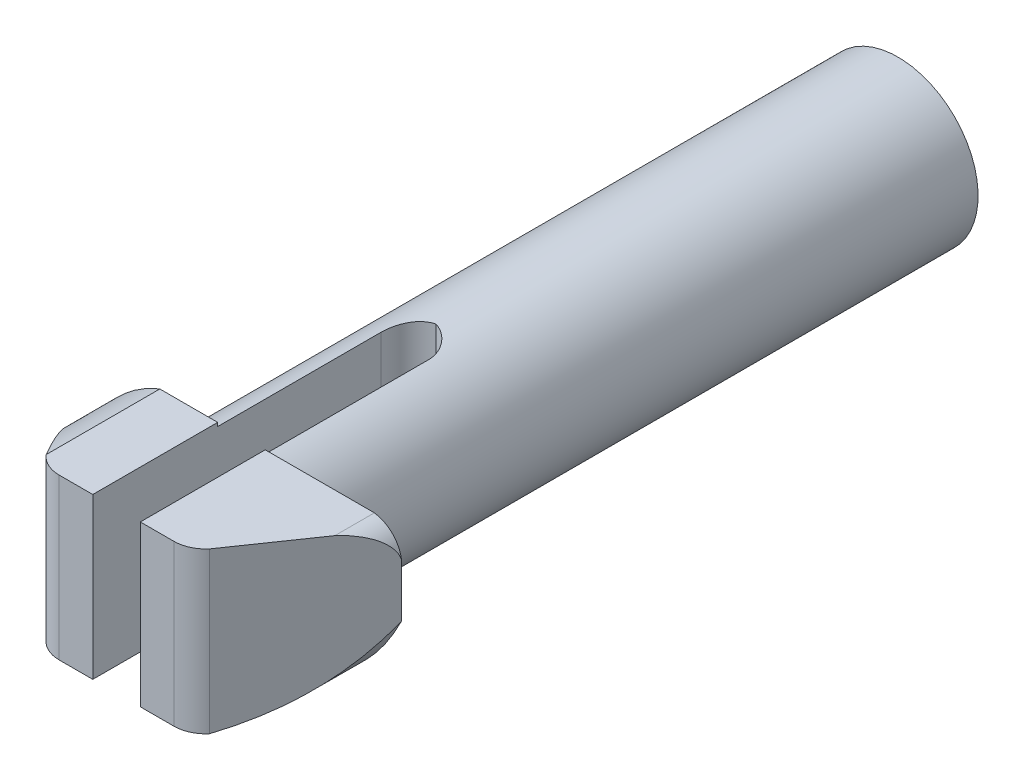
ISO-10303-21;
HEADER;
FILE_DESCRIPTION(('STEP AP214'),'2;1');
FILE_NAME('part.step','',(''),(''),'','','');
FILE_SCHEMA(('AUTOMOTIVE_DESIGN { 1 0 10303 214 1 1 1 1 }'));
ENDSEC;
DATA;
#1=APPLICATION_CONTEXT('core data for automotive mechanical design processes');
#2=APPLICATION_PROTOCOL_DEFINITION('international standard','automotive_design',2000,#1);
#3=PRODUCT_CONTEXT('',#1,'mechanical');
#4=PRODUCT('Part','Part','',(#3));
#5=PRODUCT_RELATED_PRODUCT_CATEGORY('part','',(#4));
#6=PRODUCT_DEFINITION_FORMATION('','',#4);
#7=PRODUCT_DEFINITION_CONTEXT('part definition',#1,'design');
#8=PRODUCT_DEFINITION('design','',#6,#7);
#9=PRODUCT_DEFINITION_SHAPE('','',#8);
#10=(LENGTH_UNIT() NAMED_UNIT(*) SI_UNIT(.MILLI.,.METRE.));
#11=(NAMED_UNIT(*) PLANE_ANGLE_UNIT() SI_UNIT($,.RADIAN.));
#12=(NAMED_UNIT(*) SI_UNIT($,.STERADIAN.) SOLID_ANGLE_UNIT());
#13=UNCERTAINTY_MEASURE_WITH_UNIT(LENGTH_MEASURE(1.E-05),#10,'distance_accuracy_value','');
#14=(GEOMETRIC_REPRESENTATION_CONTEXT(3) GLOBAL_UNCERTAINTY_ASSIGNED_CONTEXT((#13)) GLOBAL_UNIT_ASSIGNED_CONTEXT((#10,
#11,#12)) REPRESENTATION_CONTEXT('',''));
#15=CARTESIAN_POINT('',(0.,0.,0.));
#16=DIRECTION('',(0.,0.,1.));
#17=DIRECTION('',(1.,0.,0.));
#18=AXIS2_PLACEMENT_3D('',#15,#16,#17);
#19=CARTESIAN_POINT('',(0.583306021167324,6.35,0.));
#20=DIRECTION('',(0.,0.,-1.));
#21=DIRECTION('',(-1.,0.,0.));
#22=AXIS2_PLACEMENT_3D('',#19,#20,#21);
#23=PLANE('',#22);
#24=DIRECTION('',(1.,0.,0.));
#25=VECTOR('',#24,1.);
#26=CARTESIAN_POINT('',(0.583306021167324,0.,0.));
#27=LINE('',#26,#25);
#28=CARTESIAN_POINT('',(0.583306021167324,0.,0.));
#29=VERTEX_POINT('',#28);
#30=CARTESIAN_POINT('',(1.91439198881262,0.,0.));
#31=VERTEX_POINT('',#30);
#32=EDGE_CURVE('E184',#29,#31,#27,.T.);
#33=ORIENTED_EDGE('',*,*,#32,.T.);
#34=DIRECTION('',(0.,1.,0.));
#35=VECTOR('',#34,1.);
#36=CARTESIAN_POINT('',(1.91439198881262,-12.8393072586905,0.));
#37=LINE('',#36,#35);
#38=CARTESIAN_POINT('',(1.91439198881262,6.35,0.));
#39=VERTEX_POINT('',#38);
#40=EDGE_CURVE('E168',#31,#39,#37,.T.);
#41=ORIENTED_EDGE('',*,*,#40,.T.);
#42=DIRECTION('',(1.,0.,0.));
#43=VECTOR('',#42,1.);
#44=CARTESIAN_POINT('',(0.583306021167324,6.35,0.));
#45=LINE('',#44,#43);
#46=CARTESIAN_POINT('',(0.583306021167324,6.35,0.));
#47=VERTEX_POINT('',#46);
#48=EDGE_CURVE('E182',#47,#39,#45,.T.);
#49=ORIENTED_EDGE('',*,*,#48,.F.);
#50=DIRECTION('',(0.,-1.,0.));
#51=VECTOR('',#50,1.);
#52=CARTESIAN_POINT('',(0.583306021167324,6.35,0.));
#53=LINE('',#52,#51);
#54=EDGE_CURVE('E200',#47,#29,#53,.T.);
#55=ORIENTED_EDGE('',*,*,#54,.T.);
#56=EDGE_LOOP('',(#33,#41,#49,#55));
#57=FACE_BOUND('',#56,.T.);
#58=ADVANCED_FACE('F39',(#57),#23,.F.);
#59=CARTESIAN_POINT('',(5.13169397883267,6.35,-1.27));
#60=DIRECTION('',(0.,1.,0.));
#61=DIRECTION('',(0.,0.,1.));
#62=AXIS2_PLACEMENT_3D('',#59,#60,#61);
#63=PLANE('',#62);
#64=DIRECTION('',(0.,0.,1.));
#65=VECTOR('',#64,1.);
#66=CARTESIAN_POINT('',(1.91439198881262,6.35,0.));
#67=LINE('',#66,#65);
#68=CARTESIAN_POINT('',(1.91439198881262,6.35,-4.953));
#69=VERTEX_POINT('',#68);
#70=EDGE_CURVE('E164',#69,#39,#67,.T.);
#71=ORIENTED_EDGE('',*,*,#70,.F.);
#72=DIRECTION('',(-1.,0.,0.));
#73=VECTOR('',#72,1.);
#74=CARTESIAN_POINT('',(-0.3175,6.35,-4.953));
#75=LINE('',#74,#73);
#76=CARTESIAN_POINT('',(-0.380077487087856,6.35,-4.953));
#77=VERTEX_POINT('',#76);
#78=EDGE_CURVE('E548',#69,#77,#75,.T.);
#79=ORIENTED_EDGE('',*,*,#78,.T.);
#80=DIRECTION('',(0.,0.,1.));
#81=VECTOR('',#80,1.);
#82=CARTESIAN_POINT('',(-0.380077487087855,6.35,-9.39909929026359));
#83=LINE('',#82,#81);
#84=CARTESIAN_POINT('',(-0.380077487087855,6.35,-0.442478268550039));
#85=VERTEX_POINT('',#84);
#86=EDGE_CURVE('E310',#77,#85,#83,.T.);
#87=ORIENTED_EDGE('',*,*,#86,.T.);
#88=CARTESIAN_POINT('',(0.583306021167324,6.35,-1.27));
#89=DIRECTION('',(0.,1.,0.));
#90=DIRECTION('',(0.,0.,-1.));
#91=AXIS2_PLACEMENT_3D('',#88,#89,#90);
#92=CIRCLE('',#91,1.27);
#93=EDGE_CURVE('E191',#85,#47,#92,.T.);
#94=ORIENTED_EDGE('',*,*,#93,.T.);
#95=ORIENTED_EDGE('',*,*,#48,.T.);
#96=EDGE_LOOP('',(#71,#79,#87,#94,#95));
#97=FACE_BOUND('',#96,.T.);
#98=ADVANCED_FACE('F188',(#97),#63,.T.);
#99=CARTESIAN_POINT('',(5.13169397883267,0.,-1.27));
#100=DIRECTION('',(0.,1.,0.));
#101=DIRECTION('',(0.,0.,1.));
#102=AXIS2_PLACEMENT_3D('',#99,#100,#101);
#103=PLANE('',#102);
#104=DIRECTION('',(-1.,0.,0.));
#105=VECTOR('',#104,1.);
#106=CARTESIAN_POINT('',(-0.3175,0.,-4.953));
#107=LINE('',#106,#105);
#108=CARTESIAN_POINT('',(1.91439198881262,0.,-4.953));
#109=VERTEX_POINT('',#108);
#110=CARTESIAN_POINT('',(-2.413,0.,-4.953));
#111=VERTEX_POINT('',#110);
#112=EDGE_CURVE('E209',#109,#111,#107,.T.);
#113=ORIENTED_EDGE('',*,*,#112,.F.);
#114=DIRECTION('',(0.,0.,-1.));
#115=VECTOR('',#114,1.);
#116=CARTESIAN_POINT('',(1.91439198881262,0.,0.));
#117=LINE('',#116,#115);
#118=EDGE_CURVE('E551',#31,#109,#117,.T.);
#119=ORIENTED_EDGE('',*,*,#118,.F.);
#120=ORIENTED_EDGE('',*,*,#32,.F.);
#121=CARTESIAN_POINT('',(0.583306021167324,0.,-1.27));
#122=DIRECTION('',(0.,1.,0.));
#123=DIRECTION('',(0.,0.,-1.));
#124=AXIS2_PLACEMENT_3D('',#121,#122,#123);
#125=CIRCLE('',#124,1.27);
#126=CARTESIAN_POINT('',(-0.380077487087855,0.,-0.442478268550039));
#127=VERTEX_POINT('',#126);
#128=EDGE_CURVE('E218',#127,#29,#125,.T.);
#129=ORIENTED_EDGE('',*,*,#128,.F.);
#130=DIRECTION('',(0.567945370231995,0.,0.82306625275979));
#131=VECTOR('',#130,1.);
#132=CARTESIAN_POINT('',(-0.380077487087855,0.,-0.44247826855004));
#133=LINE('',#132,#131);
#134=CARTESIAN_POINT('',(-2.413,0.,-3.38858893790919));
#135=VERTEX_POINT('',#134);
#136=EDGE_CURVE('E215',#135,#127,#133,.T.);
#137=ORIENTED_EDGE('',*,*,#136,.F.);
#138=DIRECTION('',(0.,0.,1.));
#139=VECTOR('',#138,1.);
#140=CARTESIAN_POINT('',(-2.413,0.,-9.39909929026359));
#141=LINE('',#140,#139);
#142=EDGE_CURVE('E350',#111,#135,#141,.T.);
#143=ORIENTED_EDGE('',*,*,#142,.F.);
#144=EDGE_LOOP('',(#113,#119,#120,#129,#137,#143));
#145=FACE_BOUND('',#144,.T.);
#146=ADVANCED_FACE('F397',(#145),#103,.F.);
#147=CARTESIAN_POINT('',(-0.3175,6.35,-4.953));
#148=DIRECTION('',(0.,0.,1.));
#149=DIRECTION('',(1.,0.,0.));
#150=AXIS2_PLACEMENT_3D('',#147,#148,#149);
#151=PLANE('',#150);
#152=CARTESIAN_POINT('',(6.09507748708785,0.,-4.953));
#153=VERTEX_POINT('',#152);
#154=CARTESIAN_POINT('',(3.80060801118738,0.,-4.953));
#155=VERTEX_POINT('',#154);
#156=EDGE_CURVE('E211',#153,#155,#107,.T.);
#157=ORIENTED_EDGE('',*,*,#156,.T.);
#158=DIRECTION('',(0.,1.,0.));
#159=VECTOR('',#158,1.);
#160=CARTESIAN_POINT('',(3.80060801118737,6.35,-4.953));
#161=LINE('',#160,#159);
#162=CARTESIAN_POINT('',(3.80060801118737,0.143305378301734,-4.953));
#163=VERTEX_POINT('',#162);
#164=EDGE_CURVE('E531',#155,#163,#161,.T.);
#165=ORIENTED_EDGE('',*,*,#164,.T.);
#166=CARTESIAN_POINT('',(2.8575,3.175,-4.953));
#167=DIRECTION('',(0.,0.,-1.));
#168=DIRECTION('',(-1.,0.,0.));
#169=AXIS2_PLACEMENT_3D('',#166,#167,#168);
#170=CIRCLE('',#169,3.175);
#171=CARTESIAN_POINT('',(3.80060801118737,6.20669462169827,-4.953));
#172=VERTEX_POINT('',#171);
#173=EDGE_CURVE('E534',#172,#163,#170,.T.);
#174=ORIENTED_EDGE('',*,*,#173,.F.);
#175=CARTESIAN_POINT('',(3.80060801118738,6.35,-4.953));
#176=VERTEX_POINT('',#175);
#177=EDGE_CURVE('E526',#172,#176,#161,.T.);
#178=ORIENTED_EDGE('',*,*,#177,.T.);
#179=CARTESIAN_POINT('',(8.128,6.35,-4.953));
#180=VERTEX_POINT('',#179);
#181=EDGE_CURVE('E580',#180,#176,#75,.T.);
#182=ORIENTED_EDGE('',*,*,#181,.F.);
#183=CARTESIAN_POINT('',(7.95003143572846,5.09253143572846,-4.953));
#184=DIRECTION('',(0.,0.,1.));
#185=DIRECTION('',(1.,0.,0.));
#186=AXIS2_PLACEMENT_3D('',#183,#184,#185);
#187=CIRCLE('',#186,1.27);
#188=CARTESIAN_POINT('',(9.2075,5.2705,-4.953));
#189=VERTEX_POINT('',#188);
#190=EDGE_CURVE('E339',#189,#180,#187,.T.);
#191=ORIENTED_EDGE('',*,*,#190,.F.);
#192=DIRECTION('',(0.,-1.,0.));
#193=VECTOR('',#192,1.);
#194=CARTESIAN_POINT('',(9.2075,6.35,-4.953));
#195=LINE('',#194,#193);
#196=CARTESIAN_POINT('',(9.2075,3.175,-4.953));
#197=VERTEX_POINT('',#196);
#198=EDGE_CURVE('E235',#189,#197,#195,.T.);
#199=ORIENTED_EDGE('',*,*,#198,.T.);
#200=CARTESIAN_POINT('',(9.2075,3.175,-4.953));
#201=CARTESIAN_POINT('',(8.0010210107141,0.754914498683665,-4.953));
#202=CARTESIAN_POINT('',(6.09507748708785,0.,-4.953));
#203=B_SPLINE_CURVE_WITH_KNOTS('',2,(#200,#201,#202),.UNSPECIFIED.,.F.,.F.,(3,3),(0.,
0.5244633079158),.UNSPECIFIED.);
#204=EDGE_CURVE('E328',#153,#197,#203,.F.);
#205=ORIENTED_EDGE('',*,*,#204,.F.);
#206=EDGE_LOOP('',(#157,#165,#174,#178,#182,#191,#199,#205));
#207=FACE_BOUND('',#206,.T.);
#208=ADVANCED_FACE('F290',(#207),#151,.F.);
#209=CARTESIAN_POINT('',(5.13169397883267,6.35,-1.27));
#210=DIRECTION('',(0.,-1.,0.));
#211=DIRECTION('',(0.,0.,-1.));
#212=AXIS2_PLACEMENT_3D('',#209,#210,#211);
#213=CYLINDRICAL_SURFACE('',#212,1.27);
#214=CARTESIAN_POINT('',(5.13169397883267,0.,-1.27));
#215=DIRECTION('',(0.,1.,0.));
#216=DIRECTION('',(0.,0.,1.));
#217=AXIS2_PLACEMENT_3D('',#214,#215,#216);
#218=CIRCLE('',#217,1.27);
#219=CARTESIAN_POINT('',(5.13169397883267,0.,0.));
#220=VERTEX_POINT('',#219);
#221=CARTESIAN_POINT('',(6.09507748708785,0.,-0.44247826855004));
#222=VERTEX_POINT('',#221);
#223=EDGE_CURVE('E205',#220,#222,#218,.T.);
#224=ORIENTED_EDGE('',*,*,#223,.T.);
#225=DIRECTION('',(0.,-1.,0.));
#226=VECTOR('',#225,1.);
#227=CARTESIAN_POINT('',(6.09507748708785,6.35,-0.44247826855004));
#228=LINE('',#227,#226);
#229=CARTESIAN_POINT('',(6.09507748708785,6.35,-0.44247826855004));
#230=VERTEX_POINT('',#229);
#231=EDGE_CURVE('E239',#230,#222,#228,.T.);
#232=ORIENTED_EDGE('',*,*,#231,.F.);
#233=CARTESIAN_POINT('',(5.13169397883267,6.35,-1.27));
#234=DIRECTION('',(0.,1.,0.));
#235=DIRECTION('',(0.,0.,1.));
#236=AXIS2_PLACEMENT_3D('',#233,#234,#235);
#237=CIRCLE('',#236,1.27);
#238=CARTESIAN_POINT('',(5.13169397883267,6.35,0.));
#239=VERTEX_POINT('',#238);
#240=EDGE_CURVE('E223',#239,#230,#237,.T.);
#241=ORIENTED_EDGE('',*,*,#240,.F.);
#242=DIRECTION('',(0.,-1.,0.));
#243=VECTOR('',#242,1.);
#244=CARTESIAN_POINT('',(5.13169397883267,6.35,0.));
#245=LINE('',#244,#243);
#246=EDGE_CURVE('E194',#239,#220,#245,.T.);
#247=ORIENTED_EDGE('',*,*,#246,.T.);
#248=EDGE_LOOP('',(#224,#232,#241,#247));
#249=FACE_BOUND('',#248,.T.);
#250=ADVANCED_FACE('F285',(#249),#213,.T.);
#251=CARTESIAN_POINT('',(6.09507748708785,6.35,-0.44247826855004));
#252=DIRECTION('',(-0.823066252759789,0.,-0.567945370231996));
#253=DIRECTION('',(-0.567945370231996,0.,0.823066252759789));
#254=AXIS2_PLACEMENT_3D('',#251,#252,#253);
#255=PLANE('',#254);
#256=ORIENTED_EDGE('',*,*,#198,.F.);
#257=CARTESIAN_POINT('',(7.95003143572846,5.09253143572846,-3.13067695027527));
#258=DIRECTION('',(-0.823066252759789,0.,-0.567945370231996));
#259=DIRECTION('',(-0.567945370231996,0.,0.823066252759789));
#260=AXIS2_PLACEMENT_3D('',#257,#258,#259);
#261=ELLIPSE('',#260,2.23613056213704,1.27);
#262=CARTESIAN_POINT('',(8.128,6.35,-3.38858893790919));
#263=VERTEX_POINT('',#262);
#264=EDGE_CURVE('E210',#189,#263,#261,.F.);
#265=ORIENTED_EDGE('',*,*,#264,.T.);
#266=DIRECTION('',(0.567945370231996,0.,-0.823066252759789));
#267=VECTOR('',#266,1.);
#268=CARTESIAN_POINT('',(6.09507748708785,6.35,-0.44247826855004));
#269=LINE('',#268,#267);
#270=EDGE_CURVE('E585',#230,#263,#269,.T.);
#271=ORIENTED_EDGE('',*,*,#270,.F.);
#272=ORIENTED_EDGE('',*,*,#231,.T.);
#273=CARTESIAN_POINT('',(6.09507748708785,0.,-0.44247826855004));
#274=CARTESIAN_POINT('',(6.17948455130875,0.0334323918742528,-0.564800959597546));
#275=CARTESIAN_POINT('',(6.2635394679922,0.069582873806758,-0.686613318544011));
#276=CARTESIAN_POINT('',(6.43081607170464,0.147538470922943,-0.929030520282526));
#277=CARTESIAN_POINT('',(6.514037589653,0.189344709551855,-1.04963511804297));
#278=CARTESIAN_POINT('',(6.76226833881413,0.323585796185138,-1.40937104202514));
#279=CARTESIAN_POINT('',(6.9257823319704,0.424819073997624,-1.64633546972343));
#280=CARTESIAN_POINT('',(7.23267804511082,0.641589323014594,-2.09108864114088));
#281=CARTESIAN_POINT('',(7.37654237825701,0.755002211626706,-2.29957678770338));
#282=CARTESIAN_POINT('',(7.5879008214747,0.94055810174692,-2.60587737745423));
#283=CARTESIAN_POINT('',(7.65760520888406,1.00497347166962,-2.70689295386874));
#284=CARTESIAN_POINT('',(7.79541120923854,1.13894820560254,-2.90660136644589));
#285=CARTESIAN_POINT('',(7.86351264144775,1.20850814604392,-3.00529394068611));
#286=CARTESIAN_POINT('',(8.04966574148498,1.40819290805418,-3.2750669549897));
#287=CARTESIAN_POINT('',(8.16585649511047,1.5437569904004,-3.44345055877329));
#288=CARTESIAN_POINT('',(8.3919992806066,1.83026339872466,-3.77117661272622));
#289=CARTESIAN_POINT('',(8.50194894754284,1.98121149439369,-3.93051563563336));
#290=CARTESIAN_POINT('',(8.71555303545484,2.29835495197631,-4.24007061297225));
#291=CARTESIAN_POINT('',(8.81917005490134,2.46462861313297,-4.39023236511954));
#292=CARTESIAN_POINT('',(8.96901464036192,2.72389324959868,-4.60738709146409));
#293=CARTESIAN_POINT('',(9.01802888892429,2.81194953028952,-4.67841852513805));
#294=CARTESIAN_POINT('',(9.1141779787237,2.99117825304555,-4.8177577559784));
#295=CARTESIAN_POINT('',(9.16131293372751,3.08235050585673,-4.88606571801555));
#296=CARTESIAN_POINT('',(9.2075,3.175,-4.953));
#297=B_SPLINE_CURVE_WITH_KNOTS('',3,(#273,#274,#275,#276,#277,#278,#279,#280,#281,#282,#283,
#284,#285,#286,#287,#288,#289,#290,#291,#292,#293,#294,#295,#296),.UNSPECIFIED.,.F.,.F.,(4,2,2,
2,2,2,2,2,2,2,2,4),(0.,0.456948696861331,0.913988294496703,1.82839892175685,2.66004214580468,
3.07575596135122,3.49151642695184,4.22699755824727,4.96275554998358,5.70250639773372,
6.07232119484553,6.44211357038796),.UNSPECIFIED.);
#298=EDGE_CURVE('E299',#222,#197,#297,.T.);
#299=ORIENTED_EDGE('',*,*,#298,.T.);
#300=EDGE_LOOP('',(#256,#265,#271,#272,#299));
#301=FACE_BOUND('',#300,.T.);
#302=ADVANCED_FACE('F289',(#301),#255,.F.);
#303=ORIENTED_EDGE('',*,*,#78,.F.);
#304=DIRECTION('',(0.,-1.,0.));
#305=VECTOR('',#304,1.);
#306=CARTESIAN_POINT('',(1.91439198881262,6.35,-4.953));
#307=LINE('',#306,#305);
#308=CARTESIAN_POINT('',(1.91439198881262,6.20669462169827,-4.953));
#309=VERTEX_POINT('',#308);
#310=EDGE_CURVE('E171',#69,#309,#307,.T.);
#311=ORIENTED_EDGE('',*,*,#310,.T.);
#312=CARTESIAN_POINT('',(1.91439198881262,0.143305378301734,-4.953));
#313=VERTEX_POINT('',#312);
#314=EDGE_CURVE('E243',#313,#309,#170,.T.);
#315=ORIENTED_EDGE('',*,*,#314,.F.);
#316=EDGE_CURVE('E536',#313,#109,#307,.T.);
#317=ORIENTED_EDGE('',*,*,#316,.T.);
#318=ORIENTED_EDGE('',*,*,#112,.T.);
#319=CARTESIAN_POINT('',(-2.23503143572846,1.25746856427154,-4.953));
#320=DIRECTION('',(0.,0.,1.));
#321=DIRECTION('',(1.,0.,0.));
#322=AXIS2_PLACEMENT_3D('',#319,#320,#321);
#323=CIRCLE('',#322,1.27);
#324=CARTESIAN_POINT('',(-3.4925,1.0795,-4.953));
#325=VERTEX_POINT('',#324);
#326=EDGE_CURVE('E343',#325,#111,#323,.T.);
#327=ORIENTED_EDGE('',*,*,#326,.F.);
#328=DIRECTION('',(0.,-1.,0.));
#329=VECTOR('',#328,1.);
#330=CARTESIAN_POINT('',(-3.4925,6.35,-4.953));
#331=LINE('',#330,#329);
#332=CARTESIAN_POINT('',(-3.4925,3.175,-4.953));
#333=VERTEX_POINT('',#332);
#334=EDGE_CURVE('E231',#333,#325,#331,.T.);
#335=ORIENTED_EDGE('',*,*,#334,.F.);
#336=CARTESIAN_POINT('',(-3.4925,3.175,-4.953));
#337=CARTESIAN_POINT('',(-2.28602104428758,5.59508551304597,-4.953));
#338=CARTESIAN_POINT('',(-0.380077487087855,6.35,-4.953));
#339=B_SPLINE_CURVE_WITH_KNOTS('',2,(#336,#337,#338),.UNSPECIFIED.,.F.,.F.,(3,3),(0.,
0.524463314674072),.UNSPECIFIED.);
#340=EDGE_CURVE('E309',#77,#333,#339,.F.);
#341=ORIENTED_EDGE('',*,*,#340,.F.);
#342=EDGE_LOOP('',(#303,#311,#315,#317,#318,#327,#335,#341));
#343=FACE_BOUND('',#342,.T.);
#344=ADVANCED_FACE('F295',(#343),#151,.F.);
#345=CARTESIAN_POINT('',(-0.380077487087855,6.35,-0.44247826855004));
#346=DIRECTION('',(0.82306625275979,0.,-0.567945370231995));
#347=DIRECTION('',(-0.567945370231995,0.,-0.82306625275979));
#348=AXIS2_PLACEMENT_3D('',#345,#346,#347);
#349=PLANE('',#348);
#350=ORIENTED_EDGE('',*,*,#334,.T.);
#351=CARTESIAN_POINT('',(-2.23503143572846,1.25746856427154,-3.13067695027527));
#352=DIRECTION('',(0.82306625275979,0.,-0.567945370231995));
#353=DIRECTION('',(0.567945370231995,0.,0.82306625275979));
#354=AXIS2_PLACEMENT_3D('',#351,#352,#353);
#355=ELLIPSE('',#354,2.23613056213704,1.27);
#356=EDGE_CURVE('E308',#325,#135,#355,.F.);
#357=ORIENTED_EDGE('',*,*,#356,.T.);
#358=ORIENTED_EDGE('',*,*,#136,.T.);
#359=DIRECTION('',(0.,-1.,0.));
#360=VECTOR('',#359,1.);
#361=CARTESIAN_POINT('',(-0.380077487087855,6.35,-0.442478268550039));
#362=LINE('',#361,#360);
#363=EDGE_CURVE('E227',#85,#127,#362,.T.);
#364=ORIENTED_EDGE('',*,*,#363,.F.);
#365=CARTESIAN_POINT('',(-0.380077487087855,6.35,-0.442478268550039));
#366=CARTESIAN_POINT('',(-0.464484550578603,6.31656760952245,-0.564800958539412));
#367=CARTESIAN_POINT('',(-0.548539466553819,6.28041712906512,-0.686613316459507));
#368=CARTESIAN_POINT('',(-0.715816068897545,6.20246153502496,-0.929030516214477));
#369=CARTESIAN_POINT('',(-0.799037586185404,6.16065529799677,-1.04963511301773));
#370=CARTESIAN_POINT('',(-1.04726833349757,6.02641421627675,-1.40937103432039));
#371=CARTESIAN_POINT('',(-1.21078232553457,5.92518094191175,-1.64633546039663));
#372=CARTESIAN_POINT('',(-1.5176780339364,5.70841070145976,-2.09108862494691));
#373=CARTESIAN_POINT('',(-1.66154236353716,5.59499781834253,-2.29957676637137));
#374=CARTESIAN_POINT('',(-1.87290080163796,5.40944193688454,-2.60587734870682));
#375=CARTESIAN_POINT('',(-1.94260518736702,5.3450265699278,-2.70689292268625));
#376=CARTESIAN_POINT('',(-2.08041118442869,5.21105184202951,-2.90660133049146));
#377=CARTESIAN_POINT('',(-2.14851261502535,5.14149190465666,-3.00529390239477));
#378=CARTESIAN_POINT('',(-2.33466571700456,4.94180714444956,-3.27506691951269));
#379=CARTESIAN_POINT('',(-2.45085647395771,4.80624306005711,-3.44345052811873));
#380=CARTESIAN_POINT('',(-2.67699926552049,4.51973664607574,-3.77117659086343));
#381=CARTESIAN_POINT('',(-2.78694893519528,4.36878854679477,-3.93051561773927));
#382=CARTESIAN_POINT('',(-3.00055302801021,4.0516450801782,-4.2400706021835));
#383=CARTESIAN_POINT('',(-3.10417004960557,3.88537141356741,-4.39023235744491));
#384=CARTESIAN_POINT('',(-3.25401463758874,3.62610676785488,-4.6073870874452));
#385=CARTESIAN_POINT('',(-3.30302888687784,3.53805048389908,-4.67841852217233));
#386=CARTESIAN_POINT('',(-3.39917797788607,3.35882175428694,-4.81775775476451));
#387=CARTESIAN_POINT('',(-3.44631293337198,3.26764949788463,-4.88606571750033));
#388=CARTESIAN_POINT('',(-3.4925,3.175,-4.953));
#389=B_SPLINE_CURVE_WITH_KNOTS('',3,(#365,#366,#367,#368,#369,#370,#371,#372,#373,#374,#375,
#376,#377,#378,#379,#380,#381,#382,#383,#384,#385,#386,#387,#388),.UNSPECIFIED.,.F.,.F.,(4,2,2,
2,2,2,2,2,2,2,2,4),(0.,0.456948692181066,0.913988285148377,1.82839890341369,2.66004210367726,
3.07575590723116,3.49151636084959,4.22699751005824,4.96275551973764,5.70250638673943,
6.07232119351838,6.44211357872657),.UNSPECIFIED.);
#390=EDGE_CURVE('E374',#85,#333,#389,.T.);
#391=ORIENTED_EDGE('',*,*,#390,.T.);
#392=EDGE_LOOP('',(#350,#357,#358,#364,#391));
#393=FACE_BOUND('',#392,.T.);
#394=ADVANCED_FACE('F383',(#393),#349,.F.);
#395=CARTESIAN_POINT('',(0.583306021167324,6.35,-1.27));
#396=DIRECTION('',(0.,-1.,0.));
#397=DIRECTION('',(0.,0.,-1.));
#398=AXIS2_PLACEMENT_3D('',#395,#396,#397);
#399=CYLINDRICAL_SURFACE('',#398,1.27);
#400=ORIENTED_EDGE('',*,*,#128,.T.);
#401=ORIENTED_EDGE('',*,*,#54,.F.);
#402=ORIENTED_EDGE('',*,*,#93,.F.);
#403=ORIENTED_EDGE('',*,*,#363,.T.);
#404=EDGE_LOOP('',(#400,#401,#402,#403));
#405=FACE_BOUND('',#404,.T.);
#406=ADVANCED_FACE('F387',(#405),#399,.T.);
#407=CARTESIAN_POINT('',(3.80060801118738,6.35,0.));
#408=VERTEX_POINT('',#407);
#409=EDGE_CURVE('E195',#408,#239,#45,.T.);
#410=ORIENTED_EDGE('',*,*,#409,.F.);
#411=DIRECTION('',(0.,1.,0.));
#412=VECTOR('',#411,1.);
#413=CARTESIAN_POINT('',(3.80060801118738,-12.8393072586905,0.));
#414=LINE('',#413,#412);
#415=CARTESIAN_POINT('',(3.80060801118738,0.,0.));
#416=VERTEX_POINT('',#415);
#417=EDGE_CURVE('E186',#416,#408,#414,.T.);
#418=ORIENTED_EDGE('',*,*,#417,.F.);
#419=EDGE_CURVE('E221',#416,#220,#27,.T.);
#420=ORIENTED_EDGE('',*,*,#419,.T.);
#421=ORIENTED_EDGE('',*,*,#246,.F.);
#422=EDGE_LOOP('',(#410,#418,#420,#421));
#423=FACE_BOUND('',#422,.T.);
#424=ADVANCED_FACE('F391',(#423),#23,.F.);
#425=DIRECTION('',(0.,0.,-1.));
#426=VECTOR('',#425,1.);
#427=CARTESIAN_POINT('',(3.80060801118738,6.35,0.));
#428=LINE('',#427,#426);
#429=EDGE_CURVE('E176',#408,#176,#428,.T.);
#430=ORIENTED_EDGE('',*,*,#429,.F.);
#431=ORIENTED_EDGE('',*,*,#409,.T.);
#432=ORIENTED_EDGE('',*,*,#240,.T.);
#433=ORIENTED_EDGE('',*,*,#270,.T.);
#434=DIRECTION('',(0.,0.,1.));
#435=VECTOR('',#434,1.);
#436=CARTESIAN_POINT('',(8.128,6.35,-9.39909929026359));
#437=LINE('',#436,#435);
#438=EDGE_CURVE('E340',#180,#263,#437,.T.);
#439=ORIENTED_EDGE('',*,*,#438,.F.);
#440=ORIENTED_EDGE('',*,*,#181,.T.);
#441=EDGE_LOOP('',(#430,#431,#432,#433,#439,#440));
#442=FACE_BOUND('',#441,.T.);
#443=ADVANCED_FACE('F372',(#442),#63,.T.);
#444=ORIENTED_EDGE('',*,*,#419,.F.);
#445=DIRECTION('',(0.,0.,1.));
#446=VECTOR('',#445,1.);
#447=CARTESIAN_POINT('',(3.80060801118738,0.,0.));
#448=LINE('',#447,#446);
#449=EDGE_CURVE('E555',#155,#416,#448,.T.);
#450=ORIENTED_EDGE('',*,*,#449,.F.);
#451=ORIENTED_EDGE('',*,*,#156,.F.);
#452=DIRECTION('',(0.,0.,1.));
#453=VECTOR('',#452,1.);
#454=CARTESIAN_POINT('',(6.09507748708785,0.,-9.39909929026359));
#455=LINE('',#454,#453);
#456=EDGE_CURVE('E332',#153,#222,#455,.T.);
#457=ORIENTED_EDGE('',*,*,#456,.T.);
#458=ORIENTED_EDGE('',*,*,#223,.F.);
#459=EDGE_LOOP('',(#444,#450,#451,#457,#458));
#460=FACE_BOUND('',#459,.T.);
#461=ADVANCED_FACE('F319',(#460),#103,.F.);
#462=CARTESIAN_POINT('',(9.2075,3.175,-9.39909929026359));
#463=CARTESIAN_POINT('',(8.0010210107141,0.754914498683665,-9.39909929026359));
#464=CARTESIAN_POINT('',(6.09507748708785,0.,-9.39909929026359));
#465=B_SPLINE_CURVE_WITH_KNOTS('',2,(#462,#463,#464),.UNSPECIFIED.,.F.,.F.,(3,3),(0.,
0.5244633079158),.UNSPECIFIED.);
#466=DIRECTION('',(0.,0.,1.));
#467=VECTOR('',#466,1.);
#468=SURFACE_OF_LINEAR_EXTRUSION('',#465,#467);
#469=ORIENTED_EDGE('',*,*,#456,.F.);
#470=ORIENTED_EDGE('',*,*,#204,.T.);
#471=ORIENTED_EDGE('',*,*,#298,.F.);
#472=EDGE_LOOP('',(#469,#470,#471));
#473=FACE_BOUND('',#472,.T.);
#474=ADVANCED_FACE('F313',(#473),#468,.F.);
#475=CARTESIAN_POINT('',(-2.23503143572846,1.25746856427154,-9.39909929026359));
#476=DIRECTION('',(0.,0.,1.));
#477=DIRECTION('',(1.,0.,0.));
#478=AXIS2_PLACEMENT_3D('',#475,#476,#477);
#479=CYLINDRICAL_SURFACE('',#478,1.27);
#480=ORIENTED_EDGE('',*,*,#326,.T.);
#481=ORIENTED_EDGE('',*,*,#142,.T.);
#482=ORIENTED_EDGE('',*,*,#356,.F.);
#483=EDGE_LOOP('',(#480,#481,#482));
#484=FACE_BOUND('',#483,.T.);
#485=ADVANCED_FACE('F318',(#484),#479,.T.);
#486=CARTESIAN_POINT('',(-3.4925,3.175,-9.39909929026359));
#487=CARTESIAN_POINT('',(-2.28602104428758,5.59508551304597,-9.39909929026359));
#488=CARTESIAN_POINT('',(-0.380077487087855,6.35,-9.39909929026359));
#489=B_SPLINE_CURVE_WITH_KNOTS('',2,(#486,#487,#488),.UNSPECIFIED.,.F.,.F.,(3,3),(0.,
0.524463314674072),.UNSPECIFIED.);
#490=DIRECTION('',(0.,0.,1.));
#491=VECTOR('',#490,1.);
#492=SURFACE_OF_LINEAR_EXTRUSION('',#489,#491);
#493=ORIENTED_EDGE('',*,*,#86,.F.);
#494=ORIENTED_EDGE('',*,*,#340,.T.);
#495=ORIENTED_EDGE('',*,*,#390,.F.);
#496=EDGE_LOOP('',(#493,#494,#495));
#497=FACE_BOUND('',#496,.T.);
#498=ADVANCED_FACE('F367',(#497),#492,.F.);
#499=CARTESIAN_POINT('',(7.95003143572846,5.09253143572846,-9.39909929026359));
#500=DIRECTION('',(0.,0.,1.));
#501=DIRECTION('',(1.,0.,0.));
#502=AXIS2_PLACEMENT_3D('',#499,#500,#501);
#503=CYLINDRICAL_SURFACE('',#502,1.27);
#504=ORIENTED_EDGE('',*,*,#190,.T.);
#505=ORIENTED_EDGE('',*,*,#438,.T.);
#506=ORIENTED_EDGE('',*,*,#264,.F.);
#507=EDGE_LOOP('',(#504,#505,#506));
#508=FACE_BOUND('',#507,.T.);
#509=ADVANCED_FACE('F321',(#508),#503,.T.);
#510=CARTESIAN_POINT('',(2.8575,3.175,-30.988));
#511=DIRECTION('',(0.,0.,1.));
#512=DIRECTION('',(1.,0.,0.));
#513=AXIS2_PLACEMENT_3D('',#510,#511,#512);
#514=CYLINDRICAL_SURFACE('',#513,3.175);
#515=CARTESIAN_POINT('',(2.8575,3.175,-30.988));
#516=DIRECTION('',(0.,0.,-1.));
#517=DIRECTION('',(-1.,0.,0.));
#518=AXIS2_PLACEMENT_3D('',#515,#516,#517);
#519=CIRCLE('',#518,3.175);
#520=CARTESIAN_POINT('',(-0.317500000000002,3.175,-30.988));
#521=VERTEX_POINT('',#520);
#522=EDGE_CURVE('E353',#521,#521,#519,.T.);
#523=ORIENTED_EDGE('',*,*,#522,.F.);
#524=EDGE_LOOP('',(#523));
#525=FACE_BOUND('',#524,.T.);
#526=ORIENTED_EDGE('',*,*,#314,.T.);
#527=DIRECTION('',(0.,0.,1.));
#528=VECTOR('',#527,1.);
#529=CARTESIAN_POINT('',(1.91439198881262,6.20669462169827,-30.988));
#530=LINE('',#529,#528);
#531=CARTESIAN_POINT('',(1.91439198881262,6.20669462169827,-11.43));
#532=VERTEX_POINT('',#531);
#533=EDGE_CURVE('E253',#309,#532,#530,.F.);
#534=ORIENTED_EDGE('',*,*,#533,.T.);
#535=CARTESIAN_POINT('',(1.91439198881262,6.20669462169827,-11.43));
#536=CARTESIAN_POINT('',(1.91439124508705,6.20669068141528,-11.464978638128));
#537=CARTESIAN_POINT('',(1.91583798157214,6.20714482262355,-11.4999395360179));
#538=CARTESIAN_POINT('',(1.92160321397385,6.20893075716562,-11.5695926079378));
#539=CARTESIAN_POINT('',(1.92592099696501,6.21026233261813,-11.6042848465171));
#540=CARTESIAN_POINT('',(1.94310616070837,6.2155033041367,-11.7073886738722));
#541=CARTESIAN_POINT('',(1.96020575016849,6.22065948740492,-11.7750806079765));
#542=CARTESIAN_POINT('',(2.00511036603406,6.23352811730404,-11.906468071221));
#543=CARTESIAN_POINT('',(2.03291094023203,6.24123950064351,-11.9701652496025));
#544=CARTESIAN_POINT('',(2.09841791366121,6.258108895494,-12.0920803864269));
#545=CARTESIAN_POINT('',(2.13613034226844,6.26726778616639,-12.1502949804384));
#546=CARTESIAN_POINT('',(2.22172837185633,6.28601109337156,-12.2614084976891));
#547=CARTESIAN_POINT('',(2.26987842101531,6.29560013221101,-12.3141030626091));
#548=CARTESIAN_POINT('',(2.37445252823515,6.31348668569524,-12.4107995495817));
#549=CARTESIAN_POINT('',(2.43087652455345,6.32178420997672,-12.4548015364951));
#550=CARTESIAN_POINT('',(2.55087174360029,6.33573843794337,-12.5330452807675));
#551=CARTESIAN_POINT('',(2.61447915782783,6.34138095546465,-12.567234235027));
#552=CARTESIAN_POINT('',(2.74674749747159,6.34875661749551,-12.6243807116967));
#553=CARTESIAN_POINT('',(2.81540387942292,6.35049323344861,-12.647348193177));
#554=CARTESIAN_POINT('',(2.93444007368215,6.34944596309424,-12.6761816561946));
#555=CARTESIAN_POINT('',(2.98411125194969,6.34786383037696,-12.6851128204147));
#556=CARTESIAN_POINT('',(3.08402009027542,6.34230953065722,-12.6970307103442));
#557=CARTESIAN_POINT('',(3.13425764711379,6.33833779245472,-12.700018502141));
#558=CARTESIAN_POINT('',(3.18439198881262,6.3331270759186,-12.7));
#559=B_SPLINE_CURVE_WITH_KNOTS('',3,(#535,#536,#537,#538,#539,#540,#541,#542,#543,#544,#545,
#546,#547,#548,#549,#550,#551,#552,#553,#554,#555,#556,#557,#558),.UNSPECIFIED.,.F.,.F.,(4,2,2,
2,2,2,2,2,2,2,2,4),(0.,0.104868393695695,0.209710756659794,0.418645854900562,0.62749411826444,
0.836469719141718,1.05153552547051,1.26659972699853,1.48280035894377,1.69880876244952,
1.84989672999602,2.00095759382083),.UNSPECIFIED.);
#560=CARTESIAN_POINT('',(2.85750000000001,6.35,-12.657208876944));
#561=VERTEX_POINT('',#560);
#562=EDGE_CURVE('E62',#532,#561,#559,.T.);
#563=ORIENTED_EDGE('',*,*,#562,.T.);
#564=CARTESIAN_POINT('',(2.53060801118737,6.3331270759186,-12.7));
#565=CARTESIAN_POINT('',(2.56419160764536,6.33660599188713,-12.7000009910826));
#566=CARTESIAN_POINT('',(2.59781607627411,6.33954156157064,-12.6986668515663));
#567=CARTESIAN_POINT('',(2.66492484736457,6.34433258688593,-12.6933259829491));
#568=CARTESIAN_POINT('',(2.69840916755734,6.34618818352127,-12.6893196028882));
#569=CARTESIAN_POINT('',(2.79808687553914,6.3501363050507,-12.6733274702112));
#570=CARTESIAN_POINT('',(2.86375567211038,6.35063566479336,-12.6573686966385));
#571=CARTESIAN_POINT('',(2.99162070727105,6.34781252945162,-12.6152873769135));
#572=CARTESIAN_POINT('',(3.05381656134035,6.34448961204546,-12.5891637078571));
#573=CARTESIAN_POINT('',(3.17313469517167,6.33483941342933,-12.5275288640597));
#574=CARTESIAN_POINT('',(3.23025489878725,6.3285109094671,-12.4920138712879));
#575=CARTESIAN_POINT('',(3.33936401065331,6.31371672309863,-12.4115916654599));
#576=CARTESIAN_POINT('',(3.39118980136796,6.30520176394981,-12.3664726696405));
#577=CARTESIAN_POINT('',(3.48685803867482,6.28737941196721,-12.2685546957735));
#578=CARTESIAN_POINT('',(3.53069727849523,6.27807170301897,-12.2157526480541));
#579=CARTESIAN_POINT('',(3.61122509504589,6.25952853602364,-12.1010491910606));
#580=CARTESIAN_POINT('',(3.6474739035795,6.25031761186141,-12.0388342646933));
#581=CARTESIAN_POINT('',(3.70900755492519,6.23385214594305,-11.9089876808432));
#582=CARTESIAN_POINT('',(3.73430052962834,6.22659615466906,-11.8413600852033));
#583=CARTESIAN_POINT('',(3.76920333777062,6.21633123163965,-11.7165226072691));
#584=CARTESIAN_POINT('',(3.78094196825348,6.21276218895602,-11.659945974715));
#585=CARTESIAN_POINT('',(3.79666084900886,6.20792234212564,-11.5455934945829));
#586=CARTESIAN_POINT('',(3.80063588885642,6.20665308148663,-11.4878168679107));
#587=CARTESIAN_POINT('',(3.80060801118738,6.20669462169827,-11.43));
#588=B_SPLINE_CURVE_WITH_KNOTS('',3,(#564,#565,#566,#567,#568,#569,#570,#571,#572,#573,#574,
#575,#576,#577,#578,#579,#580,#581,#582,#583,#584,#585,#586,#587),.UNSPECIFIED.,.F.,.F.,(4,2,2,
2,2,2,2,2,2,2,2,4),(0.,0.101228266413335,0.202443313283431,0.404127490821327,0.605833954497812,
0.8076225480939,1.01443398712959,1.22132828325805,1.43807197994889,1.65465452331864,
1.82776879332913,2.00099920668426),.UNSPECIFIED.);
#589=CARTESIAN_POINT('',(3.80060801118737,6.20669462169827,-11.43));
#590=VERTEX_POINT('',#589);
#591=EDGE_CURVE('E50',#561,#590,#588,.T.);
#592=ORIENTED_EDGE('',*,*,#591,.T.);
#593=DIRECTION('',(0.,0.,1.));
#594=VECTOR('',#593,1.);
#595=CARTESIAN_POINT('',(3.80060801118737,6.20669462169827,-30.988));
#596=LINE('',#595,#594);
#597=EDGE_CURVE('E247',#590,#172,#596,.T.);
#598=ORIENTED_EDGE('',*,*,#597,.T.);
#599=ORIENTED_EDGE('',*,*,#173,.T.);
#600=DIRECTION('',(0.,0.,1.));
#601=VECTOR('',#600,1.);
#602=CARTESIAN_POINT('',(3.80060801118737,0.143305378301734,-30.988));
#603=LINE('',#602,#601);
#604=CARTESIAN_POINT('',(3.80060801118737,0.143305378301734,-11.43));
#605=VERTEX_POINT('',#604);
#606=EDGE_CURVE('E250',#163,#605,#603,.F.);
#607=ORIENTED_EDGE('',*,*,#606,.T.);
#608=CARTESIAN_POINT('',(3.80060801118738,0.143305378301734,-11.43));
#609=CARTESIAN_POINT('',(3.80060875491295,0.143309318584719,-11.464978638128));
#610=CARTESIAN_POINT('',(3.79916201842785,0.142855177376454,-11.4999395360179));
#611=CARTESIAN_POINT('',(3.79339678602615,0.141069242834382,-11.5695926079378));
#612=CARTESIAN_POINT('',(3.78907900303499,0.139737667381869,-11.6042848465171));
#613=CARTESIAN_POINT('',(3.77189383929162,0.134496695863305,-11.7073886738722));
#614=CARTESIAN_POINT('',(3.75479424983151,0.12934051259508,-11.7750806079765));
#615=CARTESIAN_POINT('',(3.70988963396594,0.116471882695964,-11.906468071221));
#616=CARTESIAN_POINT('',(3.68208905976797,0.10876049935649,-11.9701652496025));
#617=CARTESIAN_POINT('',(3.61658208633878,0.0918911045060032,-12.0920803864269));
#618=CARTESIAN_POINT('',(3.57886965773155,0.0827322138336109,-12.1502949804384));
#619=CARTESIAN_POINT('',(3.49327162814367,0.0639889066284371,-12.2614084976891));
#620=CARTESIAN_POINT('',(3.44512157898469,0.0543998677889886,-12.3141030626091));
#621=CARTESIAN_POINT('',(3.34054747176485,0.0365133143047616,-12.4107995495817));
#622=CARTESIAN_POINT('',(3.28412347544654,0.0282157900232854,-12.4548015364951));
#623=CARTESIAN_POINT('',(3.16412825639971,0.0142615620566353,-12.5330452807675));
#624=CARTESIAN_POINT('',(3.10052084217217,0.00861904453534652,-12.567234235027));
#625=CARTESIAN_POINT('',(2.9682525025284,0.00124338250449461,-12.6243807116967));
#626=CARTESIAN_POINT('',(2.89959612057708,-0.000493233448606552,-12.647348193177));
#627=CARTESIAN_POINT('',(2.78055992631785,0.000554036905763314,-12.6761816561946));
#628=CARTESIAN_POINT('',(2.73088874805031,0.00213616962303674,-12.6851128204147));
#629=CARTESIAN_POINT('',(2.63097990972458,0.00769046934278382,-12.6970307103442));
#630=CARTESIAN_POINT('',(2.58074235288621,0.011662207545283,-12.700018502141));
#631=CARTESIAN_POINT('',(2.53060801118737,0.0168729240814058,-12.7));
#632=B_SPLINE_CURVE_WITH_KNOTS('',3,(#608,#609,#610,#611,#612,#613,#614,#615,#616,#617,#618,
#619,#620,#621,#622,#623,#624,#625,#626,#627,#628,#629,#630,#631),.UNSPECIFIED.,.F.,.F.,(4,2,2,
2,2,2,2,2,2,2,2,4),(0.,0.104868393695695,0.209710756659794,0.418645854900562,0.627494118264442,
0.836469719141718,1.05153552547051,1.26659972699853,1.48280035894378,1.69880876244953,
1.84989672999602,2.00095759382083),.UNSPECIFIED.);
#633=CARTESIAN_POINT('',(2.85749999999998,0.,-12.657208876944));
#634=VERTEX_POINT('',#633);
#635=EDGE_CURVE('E11',#605,#634,#632,.T.);
#636=ORIENTED_EDGE('',*,*,#635,.T.);
#637=CARTESIAN_POINT('',(3.18439198881262,0.0168729240814054,-12.7));
#638=CARTESIAN_POINT('',(3.15080839235464,0.0133940081128723,-12.7000009910826));
#639=CARTESIAN_POINT('',(3.11718392372589,0.010458438429362,-12.6986668515663));
#640=CARTESIAN_POINT('',(3.05007515263543,0.00566741311407421,-12.6933259829491));
#641=CARTESIAN_POINT('',(3.01659083244266,0.00381181647873061,-12.6893196028882));
#642=CARTESIAN_POINT('',(2.91691312446085,-0.000136305050699579,-12.6733274702112));
#643=CARTESIAN_POINT('',(2.85124432788961,-0.000635664793358184,-12.6573686966385));
#644=CARTESIAN_POINT('',(2.72337929272895,0.00218747054838428,-12.6152873769135));
#645=CARTESIAN_POINT('',(2.66118343865965,0.00551038795454165,-12.5891637078571));
#646=CARTESIAN_POINT('',(2.54186530482832,0.0151605865706689,-12.5275288640597));
#647=CARTESIAN_POINT('',(2.48474510121275,0.0214890905329024,-12.4920138712879));
#648=CARTESIAN_POINT('',(2.37563598934668,0.0362832769013699,-12.4115916654599));
#649=CARTESIAN_POINT('',(2.32381019863204,0.0447982360501954,-12.3664726696405));
#650=CARTESIAN_POINT('',(2.22814196132518,0.0626205880327907,-12.2685546957735));
#651=CARTESIAN_POINT('',(2.18430272150477,0.0719282969810349,-12.2157526480541));
#652=CARTESIAN_POINT('',(2.10377490495411,0.0904714639763592,-12.1010491910606));
#653=CARTESIAN_POINT('',(2.0675260964205,0.0996823881385924,-12.0388342646933));
#654=CARTESIAN_POINT('',(2.0059924450748,0.116147854056947,-11.9089876808432));
#655=CARTESIAN_POINT('',(1.98069947037166,0.123403845330942,-11.8413600852033));
#656=CARTESIAN_POINT('',(1.94579666222938,0.133668768360353,-11.7165226072691));
#657=CARTESIAN_POINT('',(1.93405803174652,0.137237811043984,-11.659945974715));
#658=CARTESIAN_POINT('',(1.91833915099113,0.14207765787436,-11.5455934945829));
#659=CARTESIAN_POINT('',(1.91436411114358,0.14334691851337,-11.4878168679107));
#660=CARTESIAN_POINT('',(1.91439198881262,0.143305378301734,-11.43));
#661=B_SPLINE_CURVE_WITH_KNOTS('',3,(#637,#638,#639,#640,#641,#642,#643,#644,#645,#646,#647,
#648,#649,#650,#651,#652,#653,#654,#655,#656,#657,#658,#659,#660),.UNSPECIFIED.,.F.,.F.,(4,2,2,
2,2,2,2,2,2,2,2,4),(0.,0.101228266413335,0.20244331328343,0.404127490821327,0.605833954497812,
0.807622548093899,1.01443398712959,1.22132828325805,1.43807197994889,1.65465452331864,
1.82776879332913,2.00099920668426),.UNSPECIFIED.);
#662=CARTESIAN_POINT('',(1.91439198881262,0.143305378301734,-11.43));
#663=VERTEX_POINT('',#662);
#664=EDGE_CURVE('E270',#634,#663,#661,.T.);
#665=ORIENTED_EDGE('',*,*,#664,.T.);
#666=DIRECTION('',(0.,0.,1.));
#667=VECTOR('',#666,1.);
#668=CARTESIAN_POINT('',(1.91439198881262,0.143305378301734,-30.988));
#669=LINE('',#668,#667);
#670=EDGE_CURVE('E244',#663,#313,#669,.T.);
#671=ORIENTED_EDGE('',*,*,#670,.T.);
#672=EDGE_LOOP('',(#526,#534,#563,#592,#598,#599,#607,#636,#665,#671));
#673=FACE_BOUND('',#672,.T.);
#674=ADVANCED_FACE('F276',(#525,#673),#514,.T.);
#675=CARTESIAN_POINT('',(2.8575,3.175,-30.988));
#676=DIRECTION('',(0.,0.,-1.));
#677=DIRECTION('',(-1.,0.,0.));
#678=AXIS2_PLACEMENT_3D('',#675,#676,#677);
#679=PLANE('',#678);
#680=ORIENTED_EDGE('',*,*,#522,.T.);
#681=EDGE_LOOP('',(#680));
#682=FACE_BOUND('',#681,.T.);
#683=ADVANCED_FACE('F466',(#682),#679,.T.);
#684=CARTESIAN_POINT('',(1.91439198881262,-12.8393072586905,0.));
#685=DIRECTION('',(-1.,0.,0.));
#686=DIRECTION('',(0.,0.,1.));
#687=AXIS2_PLACEMENT_3D('',#684,#685,#686);
#688=PLANE('',#687);
#689=ORIENTED_EDGE('',*,*,#670,.F.);
#690=DIRECTION('',(0.,1.,0.));
#691=VECTOR('',#690,1.);
#692=CARTESIAN_POINT('',(1.91439198881262,6.20669462169827,-11.43));
#693=LINE('',#692,#691);
#694=EDGE_CURVE('E256',#663,#532,#693,.T.);
#695=ORIENTED_EDGE('',*,*,#694,.T.);
#696=ORIENTED_EDGE('',*,*,#533,.F.);
#697=ORIENTED_EDGE('',*,*,#310,.F.);
#698=ORIENTED_EDGE('',*,*,#70,.T.);
#699=ORIENTED_EDGE('',*,*,#40,.F.);
#700=ORIENTED_EDGE('',*,*,#118,.T.);
#701=ORIENTED_EDGE('',*,*,#316,.F.);
#702=EDGE_LOOP('',(#689,#695,#696,#697,#698,#699,#700,#701));
#703=FACE_BOUND('',#702,.T.);
#704=ADVANCED_FACE('F167',(#703),#688,.F.);
#705=CARTESIAN_POINT('',(3.80060801118738,-12.8393072586905,0.));
#706=DIRECTION('',(1.,0.,0.));
#707=DIRECTION('',(0.,0.,-1.));
#708=AXIS2_PLACEMENT_3D('',#705,#706,#707);
#709=PLANE('',#708);
#710=ORIENTED_EDGE('',*,*,#597,.F.);
#711=DIRECTION('',(0.,1.,0.));
#712=VECTOR('',#711,1.);
#713=CARTESIAN_POINT('',(3.80060801118737,0.143305378301734,-11.43));
#714=LINE('',#713,#712);
#715=EDGE_CURVE('E260',#590,#605,#714,.F.);
#716=ORIENTED_EDGE('',*,*,#715,.T.);
#717=ORIENTED_EDGE('',*,*,#606,.F.);
#718=ORIENTED_EDGE('',*,*,#164,.F.);
#719=ORIENTED_EDGE('',*,*,#449,.T.);
#720=ORIENTED_EDGE('',*,*,#417,.T.);
#721=ORIENTED_EDGE('',*,*,#429,.T.);
#722=ORIENTED_EDGE('',*,*,#177,.F.);
#723=EDGE_LOOP('',(#710,#716,#717,#718,#719,#720,#721,#722));
#724=FACE_BOUND('',#723,.T.);
#725=ADVANCED_FACE('F478',(#724),#709,.F.);
#726=CARTESIAN_POINT('',(2.53060801118737,-12.8393072586905,-11.43));
#727=DIRECTION('',(0.,-1.,0.));
#728=DIRECTION('',(0.,0.,-1.));
#729=AXIS2_PLACEMENT_3D('',#726,#727,#728);
#730=CYLINDRICAL_SURFACE('',#729,1.27);
#731=DIRECTION('',(0.,-1.,0.));
#732=VECTOR('',#731,1.);
#733=CARTESIAN_POINT('',(2.8575,3.175,-12.657208876944));
#734=LINE('',#733,#732);
#735=EDGE_CURVE('E44',#634,#561,#734,.F.);
#736=ORIENTED_EDGE('',*,*,#735,.F.);
#737=ORIENTED_EDGE('',*,*,#635,.F.);
#738=ORIENTED_EDGE('',*,*,#715,.F.);
#739=ORIENTED_EDGE('',*,*,#591,.F.);
#740=EDGE_LOOP('',(#736,#737,#738,#739));
#741=FACE_BOUND('',#740,.T.);
#742=ADVANCED_FACE('F41',(#741),#730,.F.);
#743=CARTESIAN_POINT('',(3.18439198881262,-12.8393072586905,-11.43));
#744=DIRECTION('',(0.,-1.,0.));
#745=DIRECTION('',(0.,0.,-1.));
#746=AXIS2_PLACEMENT_3D('',#743,#744,#745);
#747=CYLINDRICAL_SURFACE('',#746,1.27);
#748=ORIENTED_EDGE('',*,*,#664,.F.);
#749=ORIENTED_EDGE('',*,*,#735,.T.);
#750=ORIENTED_EDGE('',*,*,#562,.F.);
#751=ORIENTED_EDGE('',*,*,#694,.F.);
#752=EDGE_LOOP('',(#748,#749,#750,#751));
#753=FACE_BOUND('',#752,.T.);
#754=ADVANCED_FACE('F280',(#753),#747,.F.);
#755=CLOSED_SHELL('',(#58,#98,#146,#208,#250,#302,#344,#394,#406,#424,#443,#461,#474,#485,#498,
#509,#674,#683,#704,#725,#742,#754));
#756=MANIFOLD_SOLID_BREP('B2',#755);
#757=ADVANCED_BREP_SHAPE_REPRESENTATION('',(#18,#756),#14);
#758=SHAPE_DEFINITION_REPRESENTATION(#9,#757);
ENDSEC;
END-ISO-10303-21;
